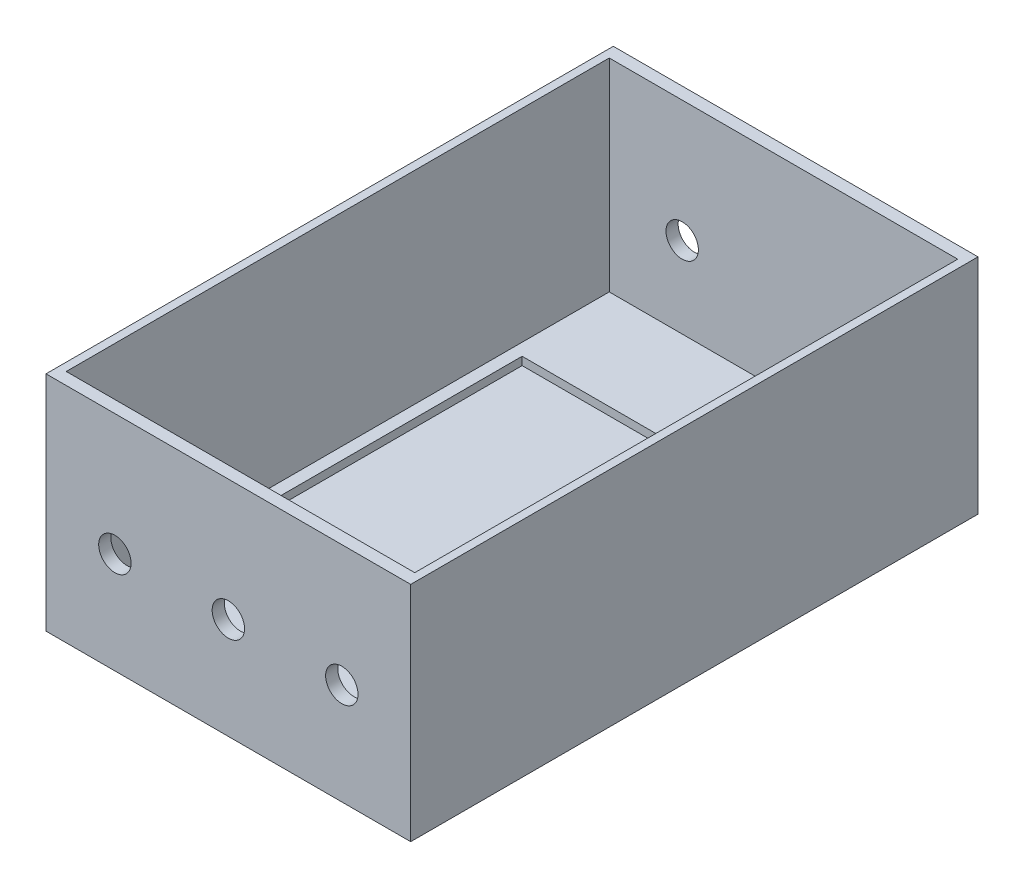
ISO-10303-21;
HEADER;
FILE_DESCRIPTION(('STEP AP214'),'2;1');
FILE_NAME('part.step','',(''),(''),'','','');
FILE_SCHEMA(('AUTOMOTIVE_DESIGN { 1 0 10303 214 1 1 1 1 }'));
ENDSEC;
DATA;
#1=APPLICATION_CONTEXT('core data for automotive mechanical design processes');
#2=APPLICATION_PROTOCOL_DEFINITION('international standard','automotive_design',2000,#1);
#3=PRODUCT_CONTEXT('',#1,'mechanical');
#4=PRODUCT('Part','Part','',(#3));
#5=PRODUCT_RELATED_PRODUCT_CATEGORY('part','',(#4));
#6=PRODUCT_DEFINITION_FORMATION('','',#4);
#7=PRODUCT_DEFINITION_CONTEXT('part definition',#1,'design');
#8=PRODUCT_DEFINITION('design','',#6,#7);
#9=PRODUCT_DEFINITION_SHAPE('','',#8);
#10=(LENGTH_UNIT() NAMED_UNIT(*) SI_UNIT(.MILLI.,.METRE.));
#11=(NAMED_UNIT(*) PLANE_ANGLE_UNIT() SI_UNIT($,.RADIAN.));
#12=(NAMED_UNIT(*) SI_UNIT($,.STERADIAN.) SOLID_ANGLE_UNIT());
#13=UNCERTAINTY_MEASURE_WITH_UNIT(LENGTH_MEASURE(1.E-05),#10,'distance_accuracy_value','');
#14=(GEOMETRIC_REPRESENTATION_CONTEXT(3) GLOBAL_UNCERTAINTY_ASSIGNED_CONTEXT((#13)) GLOBAL_UNIT_ASSIGNED_CONTEXT((#10,
#11,#12)) REPRESENTATION_CONTEXT('',''));
#15=CARTESIAN_POINT('',(0.,0.,0.));
#16=DIRECTION('',(0.,0.,1.));
#17=DIRECTION('',(1.,0.,0.));
#18=AXIS2_PLACEMENT_3D('',#15,#16,#17);
#19=CARTESIAN_POINT('',(0.,5.,0.));
#20=DIRECTION('',(0.,-1.,0.));
#21=DIRECTION('',(0.,0.,-1.));
#22=AXIS2_PLACEMENT_3D('',#19,#20,#21);
#23=PLANE('',#22);
#24=DIRECTION('',(-1.,0.,0.));
#25=VECTOR('',#24,1.);
#26=CARTESIAN_POINT('',(-40.,5.,-42.5));
#27=LINE('',#26,#25);
#28=CARTESIAN_POINT('',(40.,5.,-42.5));
#29=VERTEX_POINT('',#28);
#30=CARTESIAN_POINT('',(-40.,5.,-42.5));
#31=VERTEX_POINT('',#30);
#32=EDGE_CURVE('E189',#29,#31,#27,.T.);
#33=ORIENTED_EDGE('',*,*,#32,.F.);
#34=DIRECTION('',(0.,0.,-1.));
#35=VECTOR('',#34,1.);
#36=CARTESIAN_POINT('',(40.,5.,42.5));
#37=LINE('',#36,#35);
#38=CARTESIAN_POINT('',(40.,5.,42.5));
#39=VERTEX_POINT('',#38);
#40=EDGE_CURVE('E186',#39,#29,#37,.T.);
#41=ORIENTED_EDGE('',*,*,#40,.F.);
#42=DIRECTION('',(1.,0.,0.));
#43=VECTOR('',#42,1.);
#44=CARTESIAN_POINT('',(-40.,5.,42.5));
#45=LINE('',#44,#43);
#46=CARTESIAN_POINT('',(-40.,5.,42.5));
#47=VERTEX_POINT('',#46);
#48=EDGE_CURVE('E173',#47,#39,#45,.T.);
#49=ORIENTED_EDGE('',*,*,#48,.F.);
#50=DIRECTION('',(0.,0.,1.));
#51=VECTOR('',#50,1.);
#52=CARTESIAN_POINT('',(-40.,5.,42.5));
#53=LINE('',#52,#51);
#54=EDGE_CURVE('E193',#31,#47,#53,.T.);
#55=ORIENTED_EDGE('',*,*,#54,.F.);
#56=EDGE_LOOP('',(#33,#41,#49,#55));
#57=FACE_BOUND('',#56,.T.);
#58=DIRECTION('',(0.,0.,1.));
#59=VECTOR('',#58,1.);
#60=CARTESIAN_POINT('',(43.,5.,-67.));
#61=LINE('',#60,#59);
#62=CARTESIAN_POINT('',(43.,5.,-67.));
#63=VERTEX_POINT('',#62);
#64=CARTESIAN_POINT('',(43.,5.,67.));
#65=VERTEX_POINT('',#64);
#66=EDGE_CURVE('E132',#63,#65,#61,.T.);
#67=ORIENTED_EDGE('',*,*,#66,.F.);
#68=DIRECTION('',(1.,0.,0.));
#69=VECTOR('',#68,1.);
#70=CARTESIAN_POINT('',(-45.,5.,-67.));
#71=LINE('',#70,#69);
#72=CARTESIAN_POINT('',(-43.,5.,-67.));
#73=VERTEX_POINT('',#72);
#74=EDGE_CURVE('E156',#73,#63,#71,.T.);
#75=ORIENTED_EDGE('',*,*,#74,.F.);
#76=DIRECTION('',(0.,0.,-1.));
#77=VECTOR('',#76,1.);
#78=CARTESIAN_POINT('',(-43.,5.,-67.));
#79=LINE('',#78,#77);
#80=CARTESIAN_POINT('',(-43.,5.,67.));
#81=VERTEX_POINT('',#80);
#82=EDGE_CURVE('E141',#81,#73,#79,.T.);
#83=ORIENTED_EDGE('',*,*,#82,.F.);
#84=DIRECTION('',(-1.,0.,0.));
#85=VECTOR('',#84,1.);
#86=CARTESIAN_POINT('',(-45.,5.,67.));
#87=LINE('',#86,#85);
#88=EDGE_CURVE('E148',#65,#81,#87,.T.);
#89=ORIENTED_EDGE('',*,*,#88,.F.);
#90=EDGE_LOOP('',(#67,#75,#83,#89));
#91=FACE_BOUND('',#90,.T.);
#92=ADVANCED_FACE('F43',(#57,#91),#23,.F.);
#93=CARTESIAN_POINT('',(-45.,55.,67.));
#94=DIRECTION('',(0.,0.,1.));
#95=DIRECTION('',(1.,0.,0.));
#96=AXIS2_PLACEMENT_3D('',#93,#94,#95);
#97=PLANE('',#96);
#98=CARTESIAN_POINT('',(-28.,25.,67.));
#99=DIRECTION('',(0.,0.,1.));
#100=DIRECTION('',(1.,0.,0.));
#101=AXIS2_PLACEMENT_3D('',#98,#99,#100);
#102=CIRCLE('',#101,4.);
#103=CARTESIAN_POINT('',(-24.,25.,67.));
#104=VERTEX_POINT('',#103);
#105=EDGE_CURVE('E288',#104,#104,#102,.T.);
#106=ORIENTED_EDGE('',*,*,#105,.T.);
#107=EDGE_LOOP('',(#106));
#108=FACE_BOUND('',#107,.T.);
#109=CARTESIAN_POINT('',(28.,25.,67.));
#110=DIRECTION('',(0.,0.,1.));
#111=DIRECTION('',(1.,0.,0.));
#112=AXIS2_PLACEMENT_3D('',#109,#110,#111);
#113=CIRCLE('',#112,4.);
#114=CARTESIAN_POINT('',(32.,25.,67.));
#115=VERTEX_POINT('',#114);
#116=EDGE_CURVE('E297',#115,#115,#113,.T.);
#117=ORIENTED_EDGE('',*,*,#116,.T.);
#118=EDGE_LOOP('',(#117));
#119=FACE_BOUND('',#118,.T.);
#120=CARTESIAN_POINT('',(0.,25.,67.));
#121=DIRECTION('',(0.,0.,1.));
#122=DIRECTION('',(1.,0.,0.));
#123=AXIS2_PLACEMENT_3D('',#120,#121,#122);
#124=CIRCLE('',#123,4.);
#125=CARTESIAN_POINT('',(4.,25.,67.));
#126=VERTEX_POINT('',#125);
#127=EDGE_CURVE('E279',#126,#126,#124,.T.);
#128=ORIENTED_EDGE('',*,*,#127,.T.);
#129=EDGE_LOOP('',(#128));
#130=FACE_BOUND('',#129,.T.);
#131=DIRECTION('',(0.,-1.,0.));
#132=VECTOR('',#131,1.);
#133=CARTESIAN_POINT('',(43.,55.,67.));
#134=LINE('',#133,#132);
#135=CARTESIAN_POINT('',(43.,55.,67.));
#136=VERTEX_POINT('',#135);
#137=EDGE_CURVE('E59',#136,#65,#134,.T.);
#138=ORIENTED_EDGE('',*,*,#137,.T.);
#139=ORIENTED_EDGE('',*,*,#88,.T.);
#140=DIRECTION('',(0.,-1.,0.));
#141=VECTOR('',#140,1.);
#142=CARTESIAN_POINT('',(-43.,55.,67.));
#143=LINE('',#142,#141);
#144=CARTESIAN_POINT('',(-43.,55.,67.));
#145=VERTEX_POINT('',#144);
#146=EDGE_CURVE('E264',#145,#81,#143,.T.);
#147=ORIENTED_EDGE('',*,*,#146,.F.);
#148=DIRECTION('',(-1.,0.,0.));
#149=VECTOR('',#148,1.);
#150=CARTESIAN_POINT('',(-45.,55.,67.));
#151=LINE('',#150,#149);
#152=EDGE_CURVE('E150',#136,#145,#151,.T.);
#153=ORIENTED_EDGE('',*,*,#152,.F.);
#154=EDGE_LOOP('',(#138,#139,#147,#153));
#155=FACE_BOUND('',#154,.T.);
#156=ADVANCED_FACE('F146',(#108,#119,#130,#155),#97,.F.);
#157=CARTESIAN_POINT('',(-45.,55.,-67.));
#158=DIRECTION('',(0.,0.,-1.));
#159=DIRECTION('',(-1.,0.,0.));
#160=AXIS2_PLACEMENT_3D('',#157,#158,#159);
#161=PLANE('',#160);
#162=CARTESIAN_POINT('',(25.,25.,-67.));
#163=DIRECTION('',(0.,0.,-1.));
#164=DIRECTION('',(-1.,0.,0.));
#165=AXIS2_PLACEMENT_3D('',#162,#163,#164);
#166=CIRCLE('',#165,4.);
#167=CARTESIAN_POINT('',(21.,25.,-67.));
#168=VERTEX_POINT('',#167);
#169=EDGE_CURVE('E293',#168,#168,#166,.T.);
#170=ORIENTED_EDGE('',*,*,#169,.T.);
#171=EDGE_LOOP('',(#170));
#172=FACE_BOUND('',#171,.T.);
#173=CARTESIAN_POINT('',(-25.,25.,-67.));
#174=DIRECTION('',(0.,0.,-1.));
#175=DIRECTION('',(-1.,0.,0.));
#176=AXIS2_PLACEMENT_3D('',#173,#174,#175);
#177=CIRCLE('',#176,4.);
#178=CARTESIAN_POINT('',(-29.,25.,-67.));
#179=VERTEX_POINT('',#178);
#180=EDGE_CURVE('E304',#179,#179,#177,.T.);
#181=ORIENTED_EDGE('',*,*,#180,.T.);
#182=EDGE_LOOP('',(#181));
#183=FACE_BOUND('',#182,.T.);
#184=DIRECTION('',(0.,-1.,0.));
#185=VECTOR('',#184,1.);
#186=CARTESIAN_POINT('',(43.,55.,-67.));
#187=LINE('',#186,#185);
#188=CARTESIAN_POINT('',(43.,55.,-67.));
#189=VERTEX_POINT('',#188);
#190=EDGE_CURVE('E135',#189,#63,#187,.T.);
#191=ORIENTED_EDGE('',*,*,#190,.F.);
#192=DIRECTION('',(1.,0.,0.));
#193=VECTOR('',#192,1.);
#194=CARTESIAN_POINT('',(-45.,55.,-67.));
#195=LINE('',#194,#193);
#196=CARTESIAN_POINT('',(-43.,55.,-67.));
#197=VERTEX_POINT('',#196);
#198=EDGE_CURVE('E163',#197,#189,#195,.T.);
#199=ORIENTED_EDGE('',*,*,#198,.F.);
#200=DIRECTION('',(0.,-1.,0.));
#201=VECTOR('',#200,1.);
#202=CARTESIAN_POINT('',(-43.,55.,-67.));
#203=LINE('',#202,#201);
#204=EDGE_CURVE('E67',#197,#73,#203,.T.);
#205=ORIENTED_EDGE('',*,*,#204,.T.);
#206=ORIENTED_EDGE('',*,*,#74,.T.);
#207=EDGE_LOOP('',(#191,#199,#205,#206));
#208=FACE_BOUND('',#207,.T.);
#209=ADVANCED_FACE('F320',(#172,#183,#208),#161,.F.);
#210=CARTESIAN_POINT('',(45.,5.,70.));
#211=DIRECTION('',(-1.,0.,0.));
#212=DIRECTION('',(0.,0.,1.));
#213=AXIS2_PLACEMENT_3D('',#210,#211,#212);
#214=PLANE('',#213);
#215=DIRECTION('',(0.,0.,-1.));
#216=VECTOR('',#215,1.);
#217=CARTESIAN_POINT('',(45.,0.,70.));
#218=LINE('',#217,#216);
#219=CARTESIAN_POINT('',(45.,0.,70.));
#220=VERTEX_POINT('',#219);
#221=CARTESIAN_POINT('',(45.,0.,-70.));
#222=VERTEX_POINT('',#221);
#223=EDGE_CURVE('E203',#220,#222,#218,.T.);
#224=ORIENTED_EDGE('',*,*,#223,.T.);
#225=DIRECTION('',(0.,-1.,0.));
#226=VECTOR('',#225,1.);
#227=CARTESIAN_POINT('',(45.,5.,-70.));
#228=LINE('',#227,#226);
#229=CARTESIAN_POINT('',(45.,55.,-70.));
#230=VERTEX_POINT('',#229);
#231=EDGE_CURVE('E11',#230,#222,#228,.T.);
#232=ORIENTED_EDGE('',*,*,#231,.F.);
#233=DIRECTION('',(0.,0.,-1.));
#234=VECTOR('',#233,1.);
#235=CARTESIAN_POINT('',(45.,55.,70.));
#236=LINE('',#235,#234);
#237=CARTESIAN_POINT('',(45.,55.,70.));
#238=VERTEX_POINT('',#237);
#239=EDGE_CURVE('E252',#238,#230,#236,.T.);
#240=ORIENTED_EDGE('',*,*,#239,.F.);
#241=DIRECTION('',(0.,-1.,0.));
#242=VECTOR('',#241,1.);
#243=CARTESIAN_POINT('',(45.,5.,70.));
#244=LINE('',#243,#242);
#245=EDGE_CURVE('E225',#238,#220,#244,.T.);
#246=ORIENTED_EDGE('',*,*,#245,.T.);
#247=EDGE_LOOP('',(#224,#232,#240,#246));
#248=FACE_BOUND('',#247,.T.);
#249=ADVANCED_FACE('F45',(#248),#214,.F.);
#250=CARTESIAN_POINT('',(-45.,5.,-70.));
#251=DIRECTION('',(0.,0.,1.));
#252=DIRECTION('',(1.,0.,0.));
#253=AXIS2_PLACEMENT_3D('',#250,#251,#252);
#254=PLANE('',#253);
#255=CARTESIAN_POINT('',(25.,25.,-70.));
#256=DIRECTION('',(0.,0.,-1.));
#257=DIRECTION('',(-1.,0.,0.));
#258=AXIS2_PLACEMENT_3D('',#255,#256,#257);
#259=CIRCLE('',#258,4.);
#260=CARTESIAN_POINT('',(21.,25.,-70.));
#261=VERTEX_POINT('',#260);
#262=EDGE_CURVE('E312',#261,#261,#259,.T.);
#263=ORIENTED_EDGE('',*,*,#262,.F.);
#264=EDGE_LOOP('',(#263));
#265=FACE_BOUND('',#264,.T.);
#266=CARTESIAN_POINT('',(-25.,25.,-70.));
#267=DIRECTION('',(0.,0.,-1.));
#268=DIRECTION('',(-1.,0.,0.));
#269=AXIS2_PLACEMENT_3D('',#266,#267,#268);
#270=CIRCLE('',#269,4.);
#271=CARTESIAN_POINT('',(-29.,25.,-70.));
#272=VERTEX_POINT('',#271);
#273=EDGE_CURVE('E308',#272,#272,#270,.T.);
#274=ORIENTED_EDGE('',*,*,#273,.F.);
#275=EDGE_LOOP('',(#274));
#276=FACE_BOUND('',#275,.T.);
#277=DIRECTION('',(-1.,0.,0.));
#278=VECTOR('',#277,1.);
#279=CARTESIAN_POINT('',(-45.,0.,-70.));
#280=LINE('',#279,#278);
#281=CARTESIAN_POINT('',(-45.,0.,-70.));
#282=VERTEX_POINT('',#281);
#283=EDGE_CURVE('E216',#222,#282,#280,.T.);
#284=ORIENTED_EDGE('',*,*,#283,.T.);
#285=DIRECTION('',(0.,-1.,0.));
#286=VECTOR('',#285,1.);
#287=CARTESIAN_POINT('',(-45.,5.,-70.));
#288=LINE('',#287,#286);
#289=CARTESIAN_POINT('',(-45.,55.,-70.));
#290=VERTEX_POINT('',#289);
#291=EDGE_CURVE('E52',#290,#282,#288,.T.);
#292=ORIENTED_EDGE('',*,*,#291,.F.);
#293=DIRECTION('',(-1.,0.,0.));
#294=VECTOR('',#293,1.);
#295=CARTESIAN_POINT('',(-45.,55.,-70.));
#296=LINE('',#295,#294);
#297=EDGE_CURVE('E262',#230,#290,#296,.T.);
#298=ORIENTED_EDGE('',*,*,#297,.F.);
#299=ORIENTED_EDGE('',*,*,#231,.T.);
#300=EDGE_LOOP('',(#284,#292,#298,#299));
#301=FACE_BOUND('',#300,.T.);
#302=ADVANCED_FACE('F330',(#265,#276,#301),#254,.F.);
#303=CARTESIAN_POINT('',(-45.,5.,70.));
#304=DIRECTION('',(1.,0.,0.));
#305=DIRECTION('',(0.,0.,-1.));
#306=AXIS2_PLACEMENT_3D('',#303,#304,#305);
#307=PLANE('',#306);
#308=DIRECTION('',(0.,0.,1.));
#309=VECTOR('',#308,1.);
#310=CARTESIAN_POINT('',(-45.,0.,70.));
#311=LINE('',#310,#309);
#312=CARTESIAN_POINT('',(-45.,0.,70.));
#313=VERTEX_POINT('',#312);
#314=EDGE_CURVE('E219',#282,#313,#311,.T.);
#315=ORIENTED_EDGE('',*,*,#314,.T.);
#316=DIRECTION('',(0.,-1.,0.));
#317=VECTOR('',#316,1.);
#318=CARTESIAN_POINT('',(-45.,5.,70.));
#319=LINE('',#318,#317);
#320=CARTESIAN_POINT('',(-45.,55.,70.));
#321=VERTEX_POINT('',#320);
#322=EDGE_CURVE('E229',#321,#313,#319,.T.);
#323=ORIENTED_EDGE('',*,*,#322,.F.);
#324=DIRECTION('',(0.,0.,1.));
#325=VECTOR('',#324,1.);
#326=CARTESIAN_POINT('',(-45.,55.,70.));
#327=LINE('',#326,#325);
#328=EDGE_CURVE('E155',#290,#321,#327,.T.);
#329=ORIENTED_EDGE('',*,*,#328,.F.);
#330=ORIENTED_EDGE('',*,*,#291,.T.);
#331=EDGE_LOOP('',(#315,#323,#329,#330));
#332=FACE_BOUND('',#331,.T.);
#333=ADVANCED_FACE('F237',(#332),#307,.F.);
#334=CARTESIAN_POINT('',(-45.,5.,70.));
#335=DIRECTION('',(0.,0.,-1.));
#336=DIRECTION('',(-1.,0.,0.));
#337=AXIS2_PLACEMENT_3D('',#334,#335,#336);
#338=PLANE('',#337);
#339=CARTESIAN_POINT('',(-28.,25.,70.));
#340=DIRECTION('',(0.,0.,1.));
#341=DIRECTION('',(1.,0.,0.));
#342=AXIS2_PLACEMENT_3D('',#339,#340,#341);
#343=CIRCLE('',#342,4.);
#344=CARTESIAN_POINT('',(-24.,25.,70.));
#345=VERTEX_POINT('',#344);
#346=EDGE_CURVE('E292',#345,#345,#343,.T.);
#347=ORIENTED_EDGE('',*,*,#346,.F.);
#348=EDGE_LOOP('',(#347));
#349=FACE_BOUND('',#348,.T.);
#350=CARTESIAN_POINT('',(28.,25.,70.));
#351=DIRECTION('',(0.,0.,1.));
#352=DIRECTION('',(1.,0.,0.));
#353=AXIS2_PLACEMENT_3D('',#350,#351,#352);
#354=CIRCLE('',#353,4.);
#355=CARTESIAN_POINT('',(32.,25.,70.));
#356=VERTEX_POINT('',#355);
#357=EDGE_CURVE('E284',#356,#356,#354,.T.);
#358=ORIENTED_EDGE('',*,*,#357,.F.);
#359=EDGE_LOOP('',(#358));
#360=FACE_BOUND('',#359,.T.);
#361=CARTESIAN_POINT('',(0.,25.,70.));
#362=DIRECTION('',(0.,0.,1.));
#363=DIRECTION('',(1.,0.,0.));
#364=AXIS2_PLACEMENT_3D('',#361,#362,#363);
#365=CIRCLE('',#364,4.);
#366=CARTESIAN_POINT('',(4.,25.,70.));
#367=VERTEX_POINT('',#366);
#368=EDGE_CURVE('E280',#367,#367,#365,.T.);
#369=ORIENTED_EDGE('',*,*,#368,.F.);
#370=EDGE_LOOP('',(#369));
#371=FACE_BOUND('',#370,.T.);
#372=DIRECTION('',(1.,0.,0.));
#373=VECTOR('',#372,1.);
#374=CARTESIAN_POINT('',(-45.,0.,70.));
#375=LINE('',#374,#373);
#376=EDGE_CURVE('E222',#313,#220,#375,.T.);
#377=ORIENTED_EDGE('',*,*,#376,.T.);
#378=ORIENTED_EDGE('',*,*,#245,.F.);
#379=DIRECTION('',(1.,0.,0.));
#380=VECTOR('',#379,1.);
#381=CARTESIAN_POINT('',(-45.,55.,70.));
#382=LINE('',#381,#380);
#383=EDGE_CURVE('E161',#321,#238,#382,.T.);
#384=ORIENTED_EDGE('',*,*,#383,.F.);
#385=ORIENTED_EDGE('',*,*,#322,.T.);
#386=EDGE_LOOP('',(#377,#378,#384,#385));
#387=FACE_BOUND('',#386,.T.);
#388=ADVANCED_FACE('F246',(#349,#360,#371,#387),#338,.F.);
#389=CARTESIAN_POINT('',(0.,0.,0.));
#390=DIRECTION('',(0.,-1.,0.));
#391=DIRECTION('',(0.,0.,-1.));
#392=AXIS2_PLACEMENT_3D('',#389,#390,#391);
#393=PLANE('',#392);
#394=ORIENTED_EDGE('',*,*,#223,.F.);
#395=ORIENTED_EDGE('',*,*,#376,.F.);
#396=ORIENTED_EDGE('',*,*,#314,.F.);
#397=ORIENTED_EDGE('',*,*,#283,.F.);
#398=EDGE_LOOP('',(#394,#395,#396,#397));
#399=FACE_BOUND('',#398,.T.);
#400=ADVANCED_FACE('F244',(#399),#393,.T.);
#401=CARTESIAN_POINT('',(40.,3.,42.5));
#402=DIRECTION('',(1.,0.,0.));
#403=DIRECTION('',(0.,0.,-1.));
#404=AXIS2_PLACEMENT_3D('',#401,#402,#403);
#405=PLANE('',#404);
#406=ORIENTED_EDGE('',*,*,#40,.T.);
#407=DIRECTION('',(0.,1.,0.));
#408=VECTOR('',#407,1.);
#409=CARTESIAN_POINT('',(40.,3.,-42.5));
#410=LINE('',#409,#408);
#411=CARTESIAN_POINT('',(40.,3.,-42.5));
#412=VERTEX_POINT('',#411);
#413=EDGE_CURVE('E185',#412,#29,#410,.T.);
#414=ORIENTED_EDGE('',*,*,#413,.F.);
#415=DIRECTION('',(0.,0.,-1.));
#416=VECTOR('',#415,1.);
#417=CARTESIAN_POINT('',(40.,3.,42.5));
#418=LINE('',#417,#416);
#419=CARTESIAN_POINT('',(40.,3.,42.5));
#420=VERTEX_POINT('',#419);
#421=EDGE_CURVE('E168',#420,#412,#418,.T.);
#422=ORIENTED_EDGE('',*,*,#421,.F.);
#423=DIRECTION('',(0.,1.,0.));
#424=VECTOR('',#423,1.);
#425=CARTESIAN_POINT('',(40.,3.,42.5));
#426=LINE('',#425,#424);
#427=EDGE_CURVE('E200',#420,#39,#426,.T.);
#428=ORIENTED_EDGE('',*,*,#427,.T.);
#429=EDGE_LOOP('',(#406,#414,#422,#428));
#430=FACE_BOUND('',#429,.T.);
#431=ADVANCED_FACE('F360',(#430),#405,.F.);
#432=CARTESIAN_POINT('',(-40.,3.,42.5));
#433=DIRECTION('',(0.,0.,1.));
#434=DIRECTION('',(1.,0.,0.));
#435=AXIS2_PLACEMENT_3D('',#432,#433,#434);
#436=PLANE('',#435);
#437=ORIENTED_EDGE('',*,*,#48,.T.);
#438=ORIENTED_EDGE('',*,*,#427,.F.);
#439=DIRECTION('',(1.,0.,0.));
#440=VECTOR('',#439,1.);
#441=CARTESIAN_POINT('',(-40.,3.,42.5));
#442=LINE('',#441,#440);
#443=CARTESIAN_POINT('',(-40.,3.,42.5));
#444=VERTEX_POINT('',#443);
#445=EDGE_CURVE('E181',#444,#420,#442,.T.);
#446=ORIENTED_EDGE('',*,*,#445,.F.);
#447=DIRECTION('',(0.,1.,0.));
#448=VECTOR('',#447,1.);
#449=CARTESIAN_POINT('',(-40.,3.,42.5));
#450=LINE('',#449,#448);
#451=EDGE_CURVE('E204',#444,#47,#450,.T.);
#452=ORIENTED_EDGE('',*,*,#451,.T.);
#453=EDGE_LOOP('',(#437,#438,#446,#452));
#454=FACE_BOUND('',#453,.T.);
#455=ADVANCED_FACE('F390',(#454),#436,.F.);
#456=CARTESIAN_POINT('',(-40.,3.,42.5));
#457=DIRECTION('',(-1.,0.,0.));
#458=DIRECTION('',(0.,0.,1.));
#459=AXIS2_PLACEMENT_3D('',#456,#457,#458);
#460=PLANE('',#459);
#461=ORIENTED_EDGE('',*,*,#54,.T.);
#462=ORIENTED_EDGE('',*,*,#451,.F.);
#463=DIRECTION('',(0.,0.,1.));
#464=VECTOR('',#463,1.);
#465=CARTESIAN_POINT('',(-40.,3.,42.5));
#466=LINE('',#465,#464);
#467=CARTESIAN_POINT('',(-40.,3.,-42.5));
#468=VERTEX_POINT('',#467);
#469=EDGE_CURVE('E177',#468,#444,#466,.T.);
#470=ORIENTED_EDGE('',*,*,#469,.F.);
#471=DIRECTION('',(0.,1.,0.));
#472=VECTOR('',#471,1.);
#473=CARTESIAN_POINT('',(-40.,3.,-42.5));
#474=LINE('',#473,#472);
#475=EDGE_CURVE('E207',#468,#31,#474,.T.);
#476=ORIENTED_EDGE('',*,*,#475,.T.);
#477=EDGE_LOOP('',(#461,#462,#470,#476));
#478=FACE_BOUND('',#477,.T.);
#479=ADVANCED_FACE('F397',(#478),#460,.F.);
#480=CARTESIAN_POINT('',(-40.,3.,-42.5));
#481=DIRECTION('',(0.,0.,-1.));
#482=DIRECTION('',(-1.,0.,0.));
#483=AXIS2_PLACEMENT_3D('',#480,#481,#482);
#484=PLANE('',#483);
#485=ORIENTED_EDGE('',*,*,#32,.T.);
#486=ORIENTED_EDGE('',*,*,#475,.F.);
#487=DIRECTION('',(-1.,0.,0.));
#488=VECTOR('',#487,1.);
#489=CARTESIAN_POINT('',(-40.,3.,-42.5));
#490=LINE('',#489,#488);
#491=EDGE_CURVE('E172',#412,#468,#490,.T.);
#492=ORIENTED_EDGE('',*,*,#491,.F.);
#493=ORIENTED_EDGE('',*,*,#413,.T.);
#494=EDGE_LOOP('',(#485,#486,#492,#493));
#495=FACE_BOUND('',#494,.T.);
#496=ADVANCED_FACE('F345',(#495),#484,.F.);
#497=CARTESIAN_POINT('',(0.,3.,0.));
#498=DIRECTION('',(0.,-1.,0.));
#499=DIRECTION('',(0.,0.,-1.));
#500=AXIS2_PLACEMENT_3D('',#497,#498,#499);
#501=PLANE('',#500);
#502=ORIENTED_EDGE('',*,*,#421,.T.);
#503=ORIENTED_EDGE('',*,*,#491,.T.);
#504=ORIENTED_EDGE('',*,*,#469,.T.);
#505=ORIENTED_EDGE('',*,*,#445,.T.);
#506=EDGE_LOOP('',(#502,#503,#504,#505));
#507=FACE_BOUND('',#506,.T.);
#508=ADVANCED_FACE('F337',(#507),#501,.F.);
#509=CARTESIAN_POINT('',(0.,55.,0.));
#510=DIRECTION('',(0.,-1.,0.));
#511=DIRECTION('',(0.,0.,-1.));
#512=AXIS2_PLACEMENT_3D('',#509,#510,#511);
#513=PLANE('',#512);
#514=ORIENTED_EDGE('',*,*,#198,.T.);
#515=DIRECTION('',(0.,0.,1.));
#516=VECTOR('',#515,1.);
#517=CARTESIAN_POINT('',(43.,55.,-67.));
#518=LINE('',#517,#516);
#519=EDGE_CURVE('E142',#189,#136,#518,.T.);
#520=ORIENTED_EDGE('',*,*,#519,.T.);
#521=ORIENTED_EDGE('',*,*,#152,.T.);
#522=DIRECTION('',(0.,0.,-1.));
#523=VECTOR('',#522,1.);
#524=CARTESIAN_POINT('',(-43.,55.,-67.));
#525=LINE('',#524,#523);
#526=EDGE_CURVE('E270',#145,#197,#525,.T.);
#527=ORIENTED_EDGE('',*,*,#526,.T.);
#528=EDGE_LOOP('',(#514,#520,#521,#527));
#529=FACE_BOUND('',#528,.T.);
#530=ORIENTED_EDGE('',*,*,#328,.T.);
#531=ORIENTED_EDGE('',*,*,#383,.T.);
#532=ORIENTED_EDGE('',*,*,#239,.T.);
#533=ORIENTED_EDGE('',*,*,#297,.T.);
#534=EDGE_LOOP('',(#530,#531,#532,#533));
#535=FACE_BOUND('',#534,.T.);
#536=ADVANCED_FACE('F334',(#529,#535),#513,.F.);
#537=CARTESIAN_POINT('',(-43.,55.,-67.));
#538=DIRECTION('',(-1.,0.,0.));
#539=DIRECTION('',(0.,0.,1.));
#540=AXIS2_PLACEMENT_3D('',#537,#538,#539);
#541=PLANE('',#540);
#542=ORIENTED_EDGE('',*,*,#82,.T.);
#543=ORIENTED_EDGE('',*,*,#204,.F.);
#544=ORIENTED_EDGE('',*,*,#526,.F.);
#545=ORIENTED_EDGE('',*,*,#146,.T.);
#546=EDGE_LOOP('',(#542,#543,#544,#545));
#547=FACE_BOUND('',#546,.T.);
#548=ADVANCED_FACE('F336',(#547),#541,.F.);
#549=CARTESIAN_POINT('',(43.,55.,-67.));
#550=DIRECTION('',(1.,0.,0.));
#551=DIRECTION('',(0.,0.,-1.));
#552=AXIS2_PLACEMENT_3D('',#549,#550,#551);
#553=PLANE('',#552);
#554=ORIENTED_EDGE('',*,*,#66,.T.);
#555=ORIENTED_EDGE('',*,*,#137,.F.);
#556=ORIENTED_EDGE('',*,*,#519,.F.);
#557=ORIENTED_EDGE('',*,*,#190,.T.);
#558=EDGE_LOOP('',(#554,#555,#556,#557));
#559=FACE_BOUND('',#558,.T.);
#560=ADVANCED_FACE('F133',(#559),#553,.F.);
#561=CARTESIAN_POINT('',(0.,25.,67.));
#562=DIRECTION('',(0.,0.,1.));
#563=DIRECTION('',(1.,0.,0.));
#564=AXIS2_PLACEMENT_3D('',#561,#562,#563);
#565=CYLINDRICAL_SURFACE('',#564,4.);
#566=ORIENTED_EDGE('',*,*,#127,.F.);
#567=EDGE_LOOP('',(#566));
#568=FACE_BOUND('',#567,.T.);
#569=ORIENTED_EDGE('',*,*,#368,.T.);
#570=EDGE_LOOP('',(#569));
#571=FACE_BOUND('',#570,.T.);
#572=ADVANCED_FACE('F450',(#568,#571),#565,.F.);
#573=CARTESIAN_POINT('',(28.,25.,67.));
#574=DIRECTION('',(0.,0.,1.));
#575=DIRECTION('',(1.,0.,0.));
#576=AXIS2_PLACEMENT_3D('',#573,#574,#575);
#577=CYLINDRICAL_SURFACE('',#576,4.);
#578=ORIENTED_EDGE('',*,*,#116,.F.);
#579=EDGE_LOOP('',(#578));
#580=FACE_BOUND('',#579,.T.);
#581=ORIENTED_EDGE('',*,*,#357,.T.);
#582=EDGE_LOOP('',(#581));
#583=FACE_BOUND('',#582,.T.);
#584=ADVANCED_FACE('F508',(#580,#583),#577,.F.);
#585=CARTESIAN_POINT('',(-28.,25.,67.));
#586=DIRECTION('',(0.,0.,1.));
#587=DIRECTION('',(1.,0.,0.));
#588=AXIS2_PLACEMENT_3D('',#585,#586,#587);
#589=CYLINDRICAL_SURFACE('',#588,4.);
#590=ORIENTED_EDGE('',*,*,#105,.F.);
#591=EDGE_LOOP('',(#590));
#592=FACE_BOUND('',#591,.T.);
#593=ORIENTED_EDGE('',*,*,#346,.T.);
#594=EDGE_LOOP('',(#593));
#595=FACE_BOUND('',#594,.T.);
#596=ADVANCED_FACE('F517',(#592,#595),#589,.F.);
#597=CARTESIAN_POINT('',(-25.,25.,-67.));
#598=DIRECTION('',(0.,0.,-1.));
#599=DIRECTION('',(-1.,0.,0.));
#600=AXIS2_PLACEMENT_3D('',#597,#598,#599);
#601=CYLINDRICAL_SURFACE('',#600,4.);
#602=ORIENTED_EDGE('',*,*,#180,.F.);
#603=EDGE_LOOP('',(#602));
#604=FACE_BOUND('',#603,.T.);
#605=ORIENTED_EDGE('',*,*,#273,.T.);
#606=EDGE_LOOP('',(#605));
#607=FACE_BOUND('',#606,.T.);
#608=ADVANCED_FACE('F326',(#604,#607),#601,.F.);
#609=CARTESIAN_POINT('',(25.,25.,-67.));
#610=DIRECTION('',(0.,0.,-1.));
#611=DIRECTION('',(-1.,0.,0.));
#612=AXIS2_PLACEMENT_3D('',#609,#610,#611);
#613=CYLINDRICAL_SURFACE('',#612,4.);
#614=ORIENTED_EDGE('',*,*,#169,.F.);
#615=EDGE_LOOP('',(#614));
#616=FACE_BOUND('',#615,.T.);
#617=ORIENTED_EDGE('',*,*,#262,.T.);
#618=EDGE_LOOP('',(#617));
#619=FACE_BOUND('',#618,.T.);
#620=ADVANCED_FACE('F323',(#616,#619),#613,.F.);
#621=CLOSED_SHELL('',(#92,#156,#209,#249,#302,#333,#388,#400,#431,#455,#479,#496,#508,#536,#548,
#560,#572,#584,#596,#608,#620));
#622=MANIFOLD_SOLID_BREP('B2',#621);
#623=ADVANCED_BREP_SHAPE_REPRESENTATION('',(#18,#622),#14);
#624=SHAPE_DEFINITION_REPRESENTATION(#9,#623);
ENDSEC;
END-ISO-10303-21;
